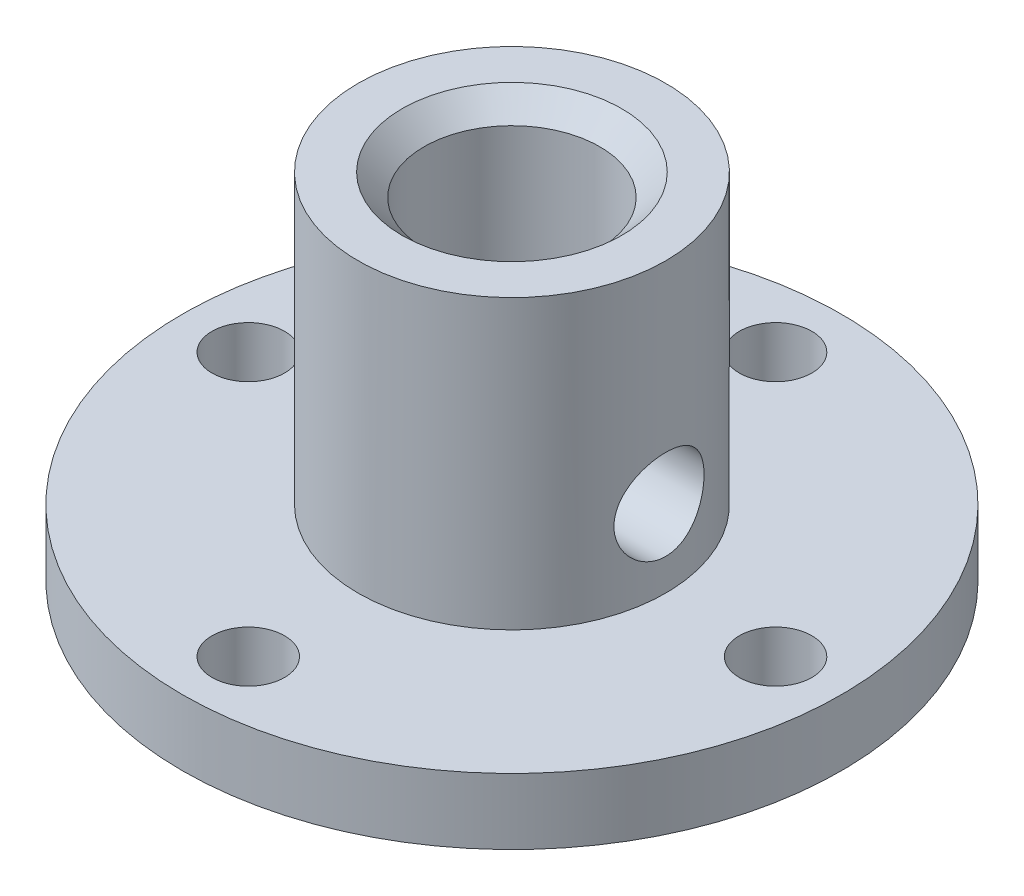
ISO-10303-21;
HEADER;
FILE_DESCRIPTION(('STEP AP214'),'2;1');
FILE_NAME('part.step','',(''),(''),'','','');
FILE_SCHEMA(('AUTOMOTIVE_DESIGN { 1 0 10303 214 1 1 1 1 }'));
ENDSEC;
DATA;
#1=APPLICATION_CONTEXT('core data for automotive mechanical design processes');
#2=APPLICATION_PROTOCOL_DEFINITION('international standard','automotive_design',2000,#1);
#3=PRODUCT_CONTEXT('',#1,'mechanical');
#4=PRODUCT('Part','Part','',(#3));
#5=PRODUCT_RELATED_PRODUCT_CATEGORY('part','',(#4));
#6=PRODUCT_DEFINITION_FORMATION('','',#4);
#7=PRODUCT_DEFINITION_CONTEXT('part definition',#1,'design');
#8=PRODUCT_DEFINITION('design','',#6,#7);
#9=PRODUCT_DEFINITION_SHAPE('','',#8);
#10=(LENGTH_UNIT() NAMED_UNIT(*) SI_UNIT(.MILLI.,.METRE.));
#11=(NAMED_UNIT(*) PLANE_ANGLE_UNIT() SI_UNIT($,.RADIAN.));
#12=(NAMED_UNIT(*) SI_UNIT($,.STERADIAN.) SOLID_ANGLE_UNIT());
#13=UNCERTAINTY_MEASURE_WITH_UNIT(LENGTH_MEASURE(1.E-05),#10,'distance_accuracy_value','');
#14=(GEOMETRIC_REPRESENTATION_CONTEXT(3) GLOBAL_UNCERTAINTY_ASSIGNED_CONTEXT((#13)) GLOBAL_UNIT_ASSIGNED_CONTEXT((#10,
#11,#12)) REPRESENTATION_CONTEXT('',''));
#15=CARTESIAN_POINT('',(0.,0.,0.));
#16=DIRECTION('',(0.,0.,1.));
#17=DIRECTION('',(1.,0.,0.));
#18=AXIS2_PLACEMENT_3D('',#15,#16,#17);
#19=CARTESIAN_POINT('',(0.,3.,0.));
#20=DIRECTION('',(0.,1.,0.));
#21=DIRECTION('',(0.,0.,1.));
#22=AXIS2_PLACEMENT_3D('',#19,#20,#21);
#23=PLANE('',#22);
#24=CARTESIAN_POINT('',(12.,3.,1.25693328198353E-13));
#25=DIRECTION('',(0.,1.,0.));
#26=DIRECTION('',(0.,0.,1.));
#27=AXIS2_PLACEMENT_3D('',#24,#25,#26);
#28=CIRCLE('',#27,1.65);
#29=CARTESIAN_POINT('',(12.,3.,1.65000000000013));
#30=VERTEX_POINT('',#29);
#31=EDGE_CURVE('E87',#30,#30,#28,.T.);
#32=ORIENTED_EDGE('',*,*,#31,.F.);
#33=EDGE_LOOP('',(#32));
#34=FACE_BOUND('',#33,.T.);
#35=CARTESIAN_POINT('',(0.,3.,12.));
#36=DIRECTION('',(0.,1.,0.));
#37=DIRECTION('',(0.,0.,1.));
#38=AXIS2_PLACEMENT_3D('',#35,#36,#37);
#39=CIRCLE('',#38,1.65);
#40=CARTESIAN_POINT('',(0.,3.,13.65));
#41=VERTEX_POINT('',#40);
#42=EDGE_CURVE('E187',#41,#41,#39,.T.);
#43=ORIENTED_EDGE('',*,*,#42,.F.);
#44=EDGE_LOOP('',(#43));
#45=FACE_BOUND('',#44,.T.);
#46=CARTESIAN_POINT('',(-12.,3.,0.));
#47=DIRECTION('',(0.,1.,0.));
#48=DIRECTION('',(0.,0.,1.));
#49=AXIS2_PLACEMENT_3D('',#46,#47,#48);
#50=CIRCLE('',#49,1.65);
#51=CARTESIAN_POINT('',(-12.,3.,1.64999999999996));
#52=VERTEX_POINT('',#51);
#53=EDGE_CURVE('E191',#52,#52,#50,.T.);
#54=ORIENTED_EDGE('',*,*,#53,.F.);
#55=EDGE_LOOP('',(#54));
#56=FACE_BOUND('',#55,.T.);
#57=CARTESIAN_POINT('',(0.,3.,-12.));
#58=DIRECTION('',(0.,1.,0.));
#59=DIRECTION('',(0.,0.,1.));
#60=AXIS2_PLACEMENT_3D('',#57,#58,#59);
#61=CIRCLE('',#60,1.65);
#62=CARTESIAN_POINT('',(0.,3.,-10.35));
#63=VERTEX_POINT('',#62);
#64=EDGE_CURVE('E127',#63,#63,#61,.T.);
#65=ORIENTED_EDGE('',*,*,#64,.F.);
#66=EDGE_LOOP('',(#65));
#67=FACE_BOUND('',#66,.T.);
#68=CARTESIAN_POINT('',(0.,3.,0.));
#69=DIRECTION('',(0.,1.,0.));
#70=DIRECTION('',(0.,0.,1.));
#71=AXIS2_PLACEMENT_3D('',#68,#69,#70);
#72=CIRCLE('',#71,15.);
#73=CARTESIAN_POINT('',(0.,3.,15.));
#74=VERTEX_POINT('',#73);
#75=EDGE_CURVE('E62',#74,#74,#72,.T.);
#76=ORIENTED_EDGE('',*,*,#75,.T.);
#77=EDGE_LOOP('',(#76));
#78=FACE_BOUND('',#77,.T.);
#79=CARTESIAN_POINT('',(0.,3.,0.));
#80=DIRECTION('',(0.,1.,0.));
#81=DIRECTION('',(0.,0.,1.));
#82=AXIS2_PLACEMENT_3D('',#79,#80,#81);
#83=CIRCLE('',#82,7.);
#84=CARTESIAN_POINT('',(0.,3.,7.));
#85=VERTEX_POINT('',#84);
#86=EDGE_CURVE('E162',#85,#85,#83,.T.);
#87=ORIENTED_EDGE('',*,*,#86,.F.);
#88=EDGE_LOOP('',(#87));
#89=FACE_BOUND('',#88,.T.);
#90=ADVANCED_FACE('F49',(#34,#45,#56,#67,#78,#89),#23,.T.);
#91=CARTESIAN_POINT('',(0.,0.,0.));
#92=DIRECTION('',(0.,1.,0.));
#93=DIRECTION('',(0.,0.,1.));
#94=AXIS2_PLACEMENT_3D('',#91,#92,#93);
#95=PLANE('',#94);
#96=CARTESIAN_POINT('',(12.,0.,1.25693328198353E-13));
#97=DIRECTION('',(0.,1.,0.));
#98=DIRECTION('',(0.,0.,1.));
#99=AXIS2_PLACEMENT_3D('',#96,#97,#98);
#100=CIRCLE('',#99,1.65);
#101=CARTESIAN_POINT('',(12.,0.,1.65000000000013));
#102=VERTEX_POINT('',#101);
#103=EDGE_CURVE('E70',#102,#102,#100,.T.);
#104=ORIENTED_EDGE('',*,*,#103,.T.);
#105=EDGE_LOOP('',(#104));
#106=FACE_BOUND('',#105,.T.);
#107=CARTESIAN_POINT('',(0.,0.,12.));
#108=DIRECTION('',(0.,1.,0.));
#109=DIRECTION('',(0.,0.,1.));
#110=AXIS2_PLACEMENT_3D('',#107,#108,#109);
#111=CIRCLE('',#110,1.65);
#112=CARTESIAN_POINT('',(0.,0.,13.65));
#113=VERTEX_POINT('',#112);
#114=EDGE_CURVE('E75',#113,#113,#111,.T.);
#115=ORIENTED_EDGE('',*,*,#114,.T.);
#116=EDGE_LOOP('',(#115));
#117=FACE_BOUND('',#116,.T.);
#118=CARTESIAN_POINT('',(-12.,0.,0.));
#119=DIRECTION('',(0.,1.,0.));
#120=DIRECTION('',(0.,0.,1.));
#121=AXIS2_PLACEMENT_3D('',#118,#119,#120);
#122=CIRCLE('',#121,1.65);
#123=CARTESIAN_POINT('',(-12.,0.,1.64999999999996));
#124=VERTEX_POINT('',#123);
#125=EDGE_CURVE('E79',#124,#124,#122,.T.);
#126=ORIENTED_EDGE('',*,*,#125,.T.);
#127=EDGE_LOOP('',(#126));
#128=FACE_BOUND('',#127,.T.);
#129=CARTESIAN_POINT('',(0.,0.,-12.));
#130=DIRECTION('',(0.,1.,0.));
#131=DIRECTION('',(0.,0.,1.));
#132=AXIS2_PLACEMENT_3D('',#129,#130,#131);
#133=CIRCLE('',#132,1.65);
#134=CARTESIAN_POINT('',(0.,0.,-10.35));
#135=VERTEX_POINT('',#134);
#136=EDGE_CURVE('E83',#135,#135,#133,.T.);
#137=ORIENTED_EDGE('',*,*,#136,.T.);
#138=EDGE_LOOP('',(#137));
#139=FACE_BOUND('',#138,.T.);
#140=CARTESIAN_POINT('',(0.,0.,0.));
#141=DIRECTION('',(0.,1.,0.));
#142=DIRECTION('',(0.,0.,1.));
#143=AXIS2_PLACEMENT_3D('',#140,#141,#142);
#144=CIRCLE('',#143,15.);
#145=CARTESIAN_POINT('',(0.,0.,15.));
#146=VERTEX_POINT('',#145);
#147=EDGE_CURVE('E67',#146,#146,#144,.T.);
#148=ORIENTED_EDGE('',*,*,#147,.F.);
#149=EDGE_LOOP('',(#148));
#150=FACE_BOUND('',#149,.T.);
#151=CARTESIAN_POINT('',(0.,0.,0.));
#152=DIRECTION('',(0.,1.,0.));
#153=DIRECTION('',(0.,0.,1.));
#154=AXIS2_PLACEMENT_3D('',#151,#152,#153);
#155=CIRCLE('',#154,4.);
#156=CARTESIAN_POINT('',(0.,0.,4.));
#157=VERTEX_POINT('',#156);
#158=EDGE_CURVE('E156',#157,#157,#155,.T.);
#159=ORIENTED_EDGE('',*,*,#158,.T.);
#160=EDGE_LOOP('',(#159));
#161=FACE_BOUND('',#160,.T.);
#162=ADVANCED_FACE('F141',(#106,#117,#128,#139,#150,#161),#95,.F.);
#163=CARTESIAN_POINT('',(0.,3.,0.));
#164=DIRECTION('',(0.,-1.,0.));
#165=DIRECTION('',(0.,0.,-1.));
#166=AXIS2_PLACEMENT_3D('',#163,#164,#165);
#167=CYLINDRICAL_SURFACE('',#166,15.);
#168=ORIENTED_EDGE('',*,*,#75,.F.);
#169=EDGE_LOOP('',(#168));
#170=FACE_BOUND('',#169,.T.);
#171=ORIENTED_EDGE('',*,*,#147,.T.);
#172=EDGE_LOOP('',(#171));
#173=FACE_BOUND('',#172,.T.);
#174=ADVANCED_FACE('F137',(#170,#173),#167,.T.);
#175=CARTESIAN_POINT('',(0.,3.,0.));
#176=DIRECTION('',(0.,-1.,0.));
#177=DIRECTION('',(0.,0.,-1.));
#178=AXIS2_PLACEMENT_3D('',#175,#176,#177);
#179=CYLINDRICAL_SURFACE('',#178,4.);
#180=CARTESIAN_POINT('',(0.,15.1000000000002,0.));
#181=DIRECTION('',(0.,1.,0.));
#182=DIRECTION('',(0.,0.,1.));
#183=AXIS2_PLACEMENT_3D('',#180,#181,#182);
#184=CIRCLE('',#183,4.);
#185=CARTESIAN_POINT('',(0.,15.1000000000002,4.));
#186=VERTEX_POINT('',#185);
#187=EDGE_CURVE('E57',#186,#186,#184,.T.);
#188=ORIENTED_EDGE('',*,*,#187,.T.);
#189=EDGE_LOOP('',(#188));
#190=FACE_BOUND('',#189,.T.);
#191=CARTESIAN_POINT('',(3.43474889911912,6.5,2.05));
#192=CARTESIAN_POINT('',(3.43476013460454,6.60639711249915,2.04999099769508));
#193=CARTESIAN_POINT('',(3.43976916731325,6.71292346502074,2.04166020355603));
#194=CARTESIAN_POINT('',(3.45906978256578,6.92267006522949,2.0087744697911));
#195=CARTESIAN_POINT('',(3.47337988610283,7.02588328429963,1.98418715727214));
#196=CARTESIAN_POINT('',(3.50917986343585,7.2255721762216,1.92015139532004));
#197=CARTESIAN_POINT('',(3.53062996278677,7.32208167096073,1.88078512238875));
#198=CARTESIAN_POINT('',(3.57823111890195,7.50710008128519,1.78856006711408));
#199=CARTESIAN_POINT('',(3.60438262844323,7.59560822505235,1.73569998502116));
#200=CARTESIAN_POINT('',(3.66121306315928,7.77059745658523,1.61260552044156));
#201=CARTESIAN_POINT('',(3.69208793471437,7.85623397770229,1.54126047281159));
#202=CARTESIAN_POINT('',(3.75330760428952,8.01498784124639,1.3855270618242));
#203=CARTESIAN_POINT('',(3.78365211882871,8.08809866189189,1.30113194690673));
#204=CARTESIAN_POINT('',(3.84299253593947,8.22486487715659,1.1143049129554));
#205=CARTESIAN_POINT('',(3.87173570781252,8.28746633218173,1.01101358212542));
#206=CARTESIAN_POINT('',(3.92206400565366,8.39401624463961,0.793615485633278));
#207=CARTESIAN_POINT('',(3.94365387156619,8.43797705921357,0.67951594646017));
#208=CARTESIAN_POINT('',(3.97582607146495,8.50260253724661,0.452700875888057));
#209=CARTESIAN_POINT('',(3.98710575481752,8.52475257461731,0.340509760011404));
#210=CARTESIAN_POINT('',(4.00000208593622,8.55003473864598,0.113481846111959));
#211=CARTESIAN_POINT('',(4.00162492402651,8.55317904855925,-0.0013532096558634));
#212=CARTESIAN_POINT('',(3.99534132622229,8.54089857431769,-0.219177580232751));
#213=CARTESIAN_POINT('',(3.98829095062873,8.52714209076627,-0.322291611273034));
#214=CARTESIAN_POINT('',(3.96676595270517,8.48445738258819,-0.524508049687891));
#215=CARTESIAN_POINT('',(3.95229077216325,8.45552801722974,-0.623610154833218));
#216=CARTESIAN_POINT('',(3.91699214020856,8.38317145566431,-0.816663567098655));
#217=CARTESIAN_POINT('',(3.89608719182987,8.33955741781451,-0.910529327027085));
#218=CARTESIAN_POINT('',(3.8497872383769,8.23934893562854,-1.0898279712547));
#219=CARTESIAN_POINT('',(3.82439065747516,8.18274993361848,-1.1752578795057));
#220=CARTESIAN_POINT('',(3.76852818226039,8.0518207533352,-1.34419686269276));
#221=CARTESIAN_POINT('',(3.73780940580388,7.97629662694336,-1.42669759354026));
#222=CARTESIAN_POINT('',(3.6763165211904,7.81283643655143,-1.57842083583647));
#223=CARTESIAN_POINT('',(3.64554238825956,7.72489009176493,-1.64763223578154));
#224=CARTESIAN_POINT('',(3.58508683556871,7.53166375915709,-1.7755276763229));
#225=CARTESIAN_POINT('',(3.55562833707739,7.42560548520832,-1.83315202332217));
#226=CARTESIAN_POINT('',(3.50438982681355,7.20346069421787,-1.92931305416218));
#227=CARTESIAN_POINT('',(3.48260150596414,7.08738519964704,-1.96787041165382));
#228=CARTESIAN_POINT('',(3.45167285173646,6.85826521600331,-2.02159613779181));
#229=CARTESIAN_POINT('',(3.44165729702902,6.74572594062961,-2.03839417316383));
#230=CARTESIAN_POINT('',(3.4329401833739,6.51902032132674,-2.0530492708407));
#231=CARTESIAN_POINT('',(3.43422964338498,6.40485534088499,-2.05092136845613));
#232=CARTESIAN_POINT('',(3.44704643633122,6.19250140442837,-2.02928080760656));
#233=CARTESIAN_POINT('',(3.45735038057704,6.09401417686002,-2.01184470887237));
#234=CARTESIAN_POINT('',(3.48518867929999,5.90157126815566,-1.9632215050227));
#235=CARTESIAN_POINT('',(3.50272553602595,5.80761716784623,-1.932029640798));
#236=CARTESIAN_POINT('',(3.54398596732181,5.62198123084128,-1.85529920190008));
#237=CARTESIAN_POINT('',(3.56795642164126,5.53060129229687,-1.80916818926662));
#238=CARTESIAN_POINT('',(3.6191850503742,5.35634344318387,-1.70437666745408));
#239=CARTESIAN_POINT('',(3.64644491521685,5.27346994490865,-1.64570970400669));
#240=CARTESIAN_POINT('',(3.70556024743405,5.10697348664303,-1.50835203246641));
#241=CARTESIAN_POINT('',(3.73754270221193,5.02473298222051,-1.42803261176893));
#242=CARTESIAN_POINT('',(3.79937740611039,4.87443411147706,-1.25428640146676));
#243=CARTESIAN_POINT('',(3.8292288135691,4.8063813284732,-1.16085447578624));
#244=CARTESIAN_POINT('',(3.88464381358749,4.6845113800162,-0.959564974077706));
#245=CARTESIAN_POINT('',(3.91004178449972,4.63121297031767,-0.851344406017709));
#246=CARTESIAN_POINT('',(3.95240402198471,4.54412311828429,-0.625796760241974));
#247=CARTESIAN_POINT('',(3.96937605229184,4.51031371396611,-0.50847818120992));
#248=CARTESIAN_POINT('',(3.99167712435216,4.46620862712543,-0.280039070644619));
#249=CARTESIAN_POINT('',(3.99795555493602,4.45399142181213,-0.169381817302036));
#250=CARTESIAN_POINT('',(4.00119156419735,4.44767298557688,0.0525683728456607));
#251=CARTESIAN_POINT('',(3.99815275796573,4.45356472837936,0.163861046382002));
#252=CARTESIAN_POINT('',(3.98364611084521,4.48206380190195,0.375531879403652));
#253=CARTESIAN_POINT('',(3.97279568886929,4.50344741731899,0.476121916714076));
#254=CARTESIAN_POINT('',(3.94437437696209,4.56061789690476,0.672101994702144));
#255=CARTESIAN_POINT('',(3.92680256800203,4.59640673076306,0.767491322237517));
#256=CARTESIAN_POINT('',(3.88560694928797,4.6828749680801,0.954795829152983));
#257=CARTESIAN_POINT('',(3.86176373649429,4.73410682233836,1.04640623234806));
#258=CARTESIAN_POINT('',(3.81045726026543,4.8493195986332,1.22009437234666));
#259=CARTESIAN_POINT('',(3.78299235896639,4.91330629562872,1.30216776437378));
#260=CARTESIAN_POINT('',(3.72376714019648,5.05989979749267,1.463448468987));
#261=CARTESIAN_POINT('',(3.69185684741221,5.14374983463882,1.54147441309439));
#262=CARTESIAN_POINT('',(3.62961340005939,5.32367704472788,1.68281984062118));
#263=CARTESIAN_POINT('',(3.59928178706434,5.41976586454226,1.74612515104685));
#264=CARTESIAN_POINT('',(3.54263576749264,5.62652085432675,1.85845823296436));
#265=CARTESIAN_POINT('',(3.51652753235566,5.73761308875499,1.90682276791521));
#266=CARTESIAN_POINT('',(3.48454363329114,5.91028955802274,1.96428815382069));
#267=CARTESIAN_POINT('',(3.4750839946301,5.96879981453381,1.98092157176426));
#268=CARTESIAN_POINT('',(3.4589426547373,6.08741759086197,2.00897497146093));
#269=CARTESIAN_POINT('',(3.45225904753724,6.1475239845367,2.02039853072993));
#270=CARTESIAN_POINT('',(3.44304501092663,6.25634643110406,2.03605144338174));
#271=CARTESIAN_POINT('',(3.43994429952378,6.30487378843443,2.04127510592413));
#272=CARTESIAN_POINT('',(3.43579359538167,6.40225832218478,2.04825156595235));
#273=CARTESIAN_POINT('',(3.43474373694085,6.45111551999388,2.05000413613664));
#274=CARTESIAN_POINT('',(3.43474889911912,6.5,2.05));
#275=B_SPLINE_CURVE_WITH_KNOTS('',3,(#191,#192,#193,#194,#195,#196,#197,#198,#199,#200,#201,
#202,#203,#204,#205,#206,#207,#208,#209,#210,#211,#212,#213,#214,#215,#216,#217,#218,#219,#220,
#221,#222,#223,#224,#225,#226,#227,#228,#229,#230,#231,#232,#233,#234,#235,#236,#237,#238,#239,
#240,#241,#242,#243,#244,#245,#246,#247,#248,#249,#250,#251,#252,#253,#254,#255,#256,#257,#258,
#259,#260,#261,#262,#263,#264,#265,#266,#267,#268,#269,#270,#271,#272,#273,#274),.UNSPECIFIED.,
.T.,.F.,(4,2,2,2,2,2,2,2,2,2,2,2,2,2,2,2,2,2,2,2,2,2,2,2,2,2,2,2,2,2,2,2,2,2,2,2,2,2,2,2,2,4),
(0.,0.318993106571399,0.638623370396568,0.956502079288199,1.27441141842652,1.61994774560716,
1.96566344069096,2.33616921995777,2.70642900031504,3.04924128635574,3.3918337958621,
3.70316374770915,4.01451710940655,4.32999191918197,4.64557762930644,4.9920845431922,
5.33887992946508,5.70966962117727,6.08005639260818,6.4206978273991,6.76106867100023,
7.06136082487838,7.36175695302759,7.67593182810163,7.99026885090682,8.34665089951267,
8.70317293209003,9.07097943408669,9.43844640408396,9.77115764329984,10.1037398067851,
10.412572071749,10.7214465790747,11.043039182816,11.3647777248348,11.7199058506169,
12.075374490222,12.4448933898131,12.6293238388937,12.8136274515198,12.9601802171637,
13.1067425793744),.UNSPECIFIED.);
#276=CARTESIAN_POINT('',(3.43474889911912,6.5,2.05));
#277=VERTEX_POINT('',#276);
#278=EDGE_CURVE('E126',#277,#277,#275,.T.);
#279=ORIENTED_EDGE('',*,*,#278,.F.);
#280=EDGE_LOOP('',(#279));
#281=FACE_BOUND('',#280,.T.);
#282=CARTESIAN_POINT('',(-3.43474889911912,6.5,2.05));
#283=CARTESIAN_POINT('',(-3.43476013460454,6.39360288750085,2.04999099769508));
#284=CARTESIAN_POINT('',(-3.43976916731325,6.28707653497925,2.04166020355603));
#285=CARTESIAN_POINT('',(-3.45906978256578,6.07732993477051,2.0087744697911));
#286=CARTESIAN_POINT('',(-3.47337988610283,5.97411671570037,1.98418715727214));
#287=CARTESIAN_POINT('',(-3.50917986343585,5.77442782377839,1.92015139532004));
#288=CARTESIAN_POINT('',(-3.53062996278677,5.67791832903926,1.88078512238875));
#289=CARTESIAN_POINT('',(-3.57823111890195,5.49289991871481,1.78856006711408));
#290=CARTESIAN_POINT('',(-3.60438262844323,5.40439177494765,1.73569998502116));
#291=CARTESIAN_POINT('',(-3.66121306315928,5.22940254341477,1.61260552044156));
#292=CARTESIAN_POINT('',(-3.69208793471437,5.14376602229771,1.54126047281158));
#293=CARTESIAN_POINT('',(-3.75330760428952,4.98501215875361,1.3855270618242));
#294=CARTESIAN_POINT('',(-3.78365211882871,4.9119013381081,1.30113194690673));
#295=CARTESIAN_POINT('',(-3.84299253593947,4.77513512284341,1.1143049129554));
#296=CARTESIAN_POINT('',(-3.87173570781252,4.71253366781826,1.01101358212542));
#297=CARTESIAN_POINT('',(-3.92206400565366,4.60598375536039,0.793615485633278));
#298=CARTESIAN_POINT('',(-3.94365387156619,4.56202294078643,0.67951594646017));
#299=CARTESIAN_POINT('',(-3.97582607146495,4.49739746275339,0.452700875888057));
#300=CARTESIAN_POINT('',(-3.98710575481752,4.47524742538269,0.340509760011404));
#301=CARTESIAN_POINT('',(-4.00000208593622,4.44996526135401,0.113481846111959));
#302=CARTESIAN_POINT('',(-4.00162492402651,4.44682095144074,-0.00135320965586327));
#303=CARTESIAN_POINT('',(-3.99534132622229,4.45910142568231,-0.21917758023275));
#304=CARTESIAN_POINT('',(-3.98829095062873,4.47285790923373,-0.322291611273034));
#305=CARTESIAN_POINT('',(-3.96676595270517,4.51554261741181,-0.524508049687891));
#306=CARTESIAN_POINT('',(-3.95229077216325,4.54447198277026,-0.623610154833217));
#307=CARTESIAN_POINT('',(-3.91699214020856,4.61682854433569,-0.816663567098654));
#308=CARTESIAN_POINT('',(-3.89608719182987,4.66044258218549,-0.910529327027084));
#309=CARTESIAN_POINT('',(-3.8497872383769,4.76065106437146,-1.0898279712547));
#310=CARTESIAN_POINT('',(-3.82439065747516,4.81725006638152,-1.1752578795057));
#311=CARTESIAN_POINT('',(-3.76852818226039,4.9481792466648,-1.34419686269276));
#312=CARTESIAN_POINT('',(-3.73780940580388,5.02370337305663,-1.42669759354026));
#313=CARTESIAN_POINT('',(-3.6763165211904,5.18716356344857,-1.57842083583647));
#314=CARTESIAN_POINT('',(-3.64554238825956,5.27510990823507,-1.64763223578154));
#315=CARTESIAN_POINT('',(-3.58508683556871,5.46833624084291,-1.7755276763229));
#316=CARTESIAN_POINT('',(-3.55562833707739,5.57439451479168,-1.83315202332217));
#317=CARTESIAN_POINT('',(-3.50438982681355,5.79653930578213,-1.92931305416218));
#318=CARTESIAN_POINT('',(-3.48260150596414,5.91261480035296,-1.96787041165382));
#319=CARTESIAN_POINT('',(-3.45167285173646,6.14173478399669,-2.02159613779181));
#320=CARTESIAN_POINT('',(-3.44165729702902,6.25427405937039,-2.03839417316382));
#321=CARTESIAN_POINT('',(-3.4329401833739,6.48097967867325,-2.0530492708407));
#322=CARTESIAN_POINT('',(-3.43422964338498,6.59514465911501,-2.05092136845613));
#323=CARTESIAN_POINT('',(-3.44704643633122,6.80749859557163,-2.02928080760656));
#324=CARTESIAN_POINT('',(-3.45735038057704,6.90598582313997,-2.01184470887237));
#325=CARTESIAN_POINT('',(-3.48518867929999,7.09842873184434,-1.9632215050227));
#326=CARTESIAN_POINT('',(-3.50272553602594,7.19238283215377,-1.932029640798));
#327=CARTESIAN_POINT('',(-3.54398596732181,7.37801876915872,-1.85529920190008));
#328=CARTESIAN_POINT('',(-3.56795642164126,7.46939870770312,-1.80916818926662));
#329=CARTESIAN_POINT('',(-3.6191850503742,7.64365655681613,-1.70437666745408));
#330=CARTESIAN_POINT('',(-3.64644491521685,7.72653005509134,-1.64570970400669));
#331=CARTESIAN_POINT('',(-3.70556024743405,7.89302651335697,-1.50835203246641));
#332=CARTESIAN_POINT('',(-3.73754270221193,7.97526701777948,-1.42803261176893));
#333=CARTESIAN_POINT('',(-3.79937740611039,8.12556588852293,-1.25428640146676));
#334=CARTESIAN_POINT('',(-3.8292288135691,8.1936186715268,-1.16085447578624));
#335=CARTESIAN_POINT('',(-3.88464381358749,8.3154886199838,-0.959564974077707));
#336=CARTESIAN_POINT('',(-3.91004178449972,8.36878702968233,-0.85134440601771));
#337=CARTESIAN_POINT('',(-3.95240402198471,8.45587688171571,-0.625796760241975));
#338=CARTESIAN_POINT('',(-3.96937605229184,8.48968628603389,-0.50847818120992));
#339=CARTESIAN_POINT('',(-3.99167712435215,8.53379137287457,-0.280039070644621));
#340=CARTESIAN_POINT('',(-3.99795555493602,8.54600857818787,-0.169381817302038));
#341=CARTESIAN_POINT('',(-4.00119156419735,8.55232701442312,0.0525683728456586));
#342=CARTESIAN_POINT('',(-3.99815275796573,8.54643527162064,0.163861046382001));
#343=CARTESIAN_POINT('',(-3.98364611084521,8.51793619809805,0.375531879403651));
#344=CARTESIAN_POINT('',(-3.97279568886929,8.49655258268101,0.476121916714075));
#345=CARTESIAN_POINT('',(-3.94437437696209,8.43938210309523,0.672101994702143));
#346=CARTESIAN_POINT('',(-3.92680256800203,8.40359326923693,0.767491322237516));
#347=CARTESIAN_POINT('',(-3.88560694928797,8.3171250319199,0.954795829152983));
#348=CARTESIAN_POINT('',(-3.86176373649429,8.26589317766164,1.04640623234806));
#349=CARTESIAN_POINT('',(-3.81045726026543,8.1506804013668,1.22009437234666));
#350=CARTESIAN_POINT('',(-3.7829923589664,8.08669370437128,1.30216776437378));
#351=CARTESIAN_POINT('',(-3.72376714019648,7.94010020250733,1.463448468987));
#352=CARTESIAN_POINT('',(-3.69185684741221,7.85625016536118,1.54147441309439));
#353=CARTESIAN_POINT('',(-3.62961340005939,7.67632295527212,1.68281984062118));
#354=CARTESIAN_POINT('',(-3.59928178706434,7.58023413545774,1.74612515104685));
#355=CARTESIAN_POINT('',(-3.54263576749264,7.37347914567325,1.85845823296436));
#356=CARTESIAN_POINT('',(-3.51652753235566,7.26238691124501,1.90682276791521));
#357=CARTESIAN_POINT('',(-3.48454363329114,7.08971044197726,1.96428815382069));
#358=CARTESIAN_POINT('',(-3.4750839946301,7.03120018546618,1.98092157176426));
#359=CARTESIAN_POINT('',(-3.4589426547373,6.91258240913802,2.00897497146093));
#360=CARTESIAN_POINT('',(-3.45225904753724,6.8524760154633,2.02039853072993));
#361=CARTESIAN_POINT('',(-3.44304501092663,6.74365356889594,2.03605144338174));
#362=CARTESIAN_POINT('',(-3.43994429952378,6.69512621156556,2.04127510592413));
#363=CARTESIAN_POINT('',(-3.43579359538167,6.59774167781521,2.04825156595235));
#364=CARTESIAN_POINT('',(-3.43474373694085,6.54888448000612,2.05000413613664));
#365=CARTESIAN_POINT('',(-3.43474889911912,6.5,2.05));
#366=B_SPLINE_CURVE_WITH_KNOTS('',3,(#282,#283,#284,#285,#286,#287,#288,#289,#290,#291,#292,
#293,#294,#295,#296,#297,#298,#299,#300,#301,#302,#303,#304,#305,#306,#307,#308,#309,#310,#311,
#312,#313,#314,#315,#316,#317,#318,#319,#320,#321,#322,#323,#324,#325,#326,#327,#328,#329,#330,
#331,#332,#333,#334,#335,#336,#337,#338,#339,#340,#341,#342,#343,#344,#345,#346,#347,#348,#349,
#350,#351,#352,#353,#354,#355,#356,#357,#358,#359,#360,#361,#362,#363,#364,#365),.UNSPECIFIED.,
.T.,.F.,(4,2,2,2,2,2,2,2,2,2,2,2,2,2,2,2,2,2,2,2,2,2,2,2,2,2,2,2,2,2,2,2,2,2,2,2,2,2,2,2,2,4),
(0.,0.318993106571399,0.638623370396568,0.956502079288199,1.27441141842652,1.61994774560716,
1.96566344069096,2.33616921995777,2.70642900031504,3.04924128635574,3.3918337958621,
3.70316374770915,4.01451710940655,4.32999191918197,4.64557762930644,4.9920845431922,
5.33887992946508,5.70966962117727,6.08005639260818,6.4206978273991,6.76106867100023,
7.06136082487838,7.36175695302759,7.67593182810163,7.99026885090682,8.34665089951267,
8.70317293209003,9.07097943408669,9.43844640408395,9.77115764329983,10.1037398067851,
10.412572071749,10.7214465790747,11.043039182816,11.3647777248348,11.7199058506169,
12.075374490222,12.4448933898131,12.6293238388937,12.8136274515198,12.9601802171636,
13.1067425793744),.UNSPECIFIED.);
#367=CARTESIAN_POINT('',(-3.43474889911912,6.5,2.05));
#368=VERTEX_POINT('',#367);
#369=EDGE_CURVE('E97',#368,#368,#366,.T.);
#370=ORIENTED_EDGE('',*,*,#369,.F.);
#371=EDGE_LOOP('',(#370));
#372=FACE_BOUND('',#371,.T.);
#373=ORIENTED_EDGE('',*,*,#158,.F.);
#374=EDGE_LOOP('',(#373));
#375=FACE_BOUND('',#374,.T.);
#376=ADVANCED_FACE('F133',(#190,#281,#372,#375),#179,.F.);
#377=CARTESIAN_POINT('',(0.,35.8989898732235,0.));
#378=DIRECTION('',(0.,-1.,0.));
#379=DIRECTION('',(0.,0.,-1.));
#380=AXIS2_PLACEMENT_3D('',#377,#378,#379);
#381=CYLINDRICAL_SURFACE('',#380,7.);
#382=CARTESIAN_POINT('',(6.69309345519693,6.5,2.05));
#383=CARTESIAN_POINT('',(6.69309483944126,6.612466900375,2.04999827320297));
#384=CARTESIAN_POINT('',(6.69595921651108,6.72495102238163,2.04071328284842));
#385=CARTESIAN_POINT('',(6.70706409813926,6.94663961785352,2.00390858065056));
#386=CARTESIAN_POINT('',(6.71530659473429,7.05584286040867,1.97638211216836));
#387=CARTESIAN_POINT('',(6.73615587030447,7.26772898524647,1.90410208356032));
#388=CARTESIAN_POINT('',(6.74875564149725,7.37042202592775,1.85937617235207));
#389=CARTESIAN_POINT('',(6.77689043255926,7.56687034312122,1.7540568598823));
#390=CARTESIAN_POINT('',(6.79242584631495,7.66062441771519,1.69346132891123));
#391=CARTESIAN_POINT('',(6.8252068251474,7.83936074132605,1.5561668599668));
#392=CARTESIAN_POINT('',(6.84248750487832,7.92403355024156,1.47907337246136));
#393=CARTESIAN_POINT('',(6.87651127603836,8.07945234998986,1.31181760491498));
#394=CARTESIAN_POINT('',(6.89325430131559,8.15019663253866,1.22165372418862));
#395=CARTESIAN_POINT('',(6.92471358689777,8.27708193735218,1.02862769072689));
#396=CARTESIAN_POINT('',(6.93938363646108,8.33290920793237,0.925551104340486));
#397=CARTESIAN_POINT('',(6.96463721828542,8.42631889384907,0.710970842308477));
#398=CARTESIAN_POINT('',(6.97522158830163,8.46390504987332,0.599468899867296));
#399=CARTESIAN_POINT('',(6.99086282013078,8.51874658697159,0.374438822693844));
#400=CARTESIAN_POINT('',(6.99606290442392,8.5365297608818,0.261049448679591));
#401=CARTESIAN_POINT('',(7.00085322506315,8.5529275544537,0.0327853149521674));
#402=CARTESIAN_POINT('',(7.00044458608044,8.5515460170569,-0.0820891423540254));
#403=CARTESIAN_POINT('',(6.99416557208107,8.53001177651844,-0.306366390062179));
#404=CARTESIAN_POINT('',(6.98846141498169,8.51043031826543,-0.415829410790819));
#405=CARTESIAN_POINT('',(6.97243297785913,8.45398291021688,-0.629841548069563));
#406=CARTESIAN_POINT('',(6.96210841079146,8.41711588654317,-0.734390358876783));
#407=CARTESIAN_POINT('',(6.93776572425408,8.32674589514117,-0.936986490274225));
#408=CARTESIAN_POINT('',(6.92370720342515,8.27305972843847,-1.03494703885868));
#409=CARTESIAN_POINT('',(6.89339316924884,8.15071928075715,-1.22065427763934));
#410=CARTESIAN_POINT('',(6.87713715484778,8.08206158390306,-1.30839862990832));
#411=CARTESIAN_POINT('',(6.8434666814895,7.92874829664306,-1.47459263730577));
#412=CARTESIAN_POINT('',(6.82603160651709,7.84359690540699,-1.55258133812349));
#413=CARTESIAN_POINT('',(6.79249491251666,7.66125130274142,-1.69329842771367));
#414=CARTESIAN_POINT('',(6.77639341345408,7.56405600982895,-1.75602544456128));
#415=CARTESIAN_POINT('',(6.74725168083989,7.35921648194782,-1.86488933742332));
#416=CARTESIAN_POINT('',(6.73423949616148,7.25148818168268,-1.91087608828835));
#417=CARTESIAN_POINT('',(6.71308523101307,7.02934837594316,-1.98392271506866));
#418=CARTESIAN_POINT('',(6.70494164937856,6.91493894245665,-2.01098842545391));
#419=CARTESIAN_POINT('',(6.69477400140158,6.68705492273792,-2.04457820887314));
#420=CARTESIAN_POINT('',(6.692542158909,6.57369236946974,-2.05180007622874));
#421=CARTESIAN_POINT('',(6.69387747182624,6.34737391560914,-2.04744003256902));
#422=CARTESIAN_POINT('',(6.69744386067695,6.23441796324038,-2.03586060719163));
#423=CARTESIAN_POINT('',(6.70977056369052,6.01497893829149,-1.99484680983796));
#424=CARTESIAN_POINT('',(6.71840201031685,5.90840517466871,-1.9658550352883));
#425=CARTESIAN_POINT('',(6.73975445882895,5.70163959690726,-1.8913491937339));
#426=CARTESIAN_POINT('',(6.7524760715344,5.60144873866207,-1.84583265881328));
#427=CARTESIAN_POINT('',(6.78098357958267,5.40743681044429,-1.73822527569995));
#428=CARTESIAN_POINT('',(6.79684004077533,5.31384665403929,-1.67573725335076));
#429=CARTESIAN_POINT('',(6.82967592108244,5.13822531237394,-1.53643689169443));
#430=CARTESIAN_POINT('',(6.84665559558918,5.05619676931832,-1.45962128735743));
#431=CARTESIAN_POINT('',(6.88055882310651,4.9030100289444,-1.29057732939534));
#432=CARTESIAN_POINT('',(6.89745870500806,4.8323448054367,-1.19789642896676));
#433=CARTESIAN_POINT('',(6.9286848338683,4.70756196539247,-1.00159324953194));
#434=CARTESIAN_POINT('',(6.94301121255085,4.65344350181619,-0.897971530958963));
#435=CARTESIAN_POINT('',(6.96738650008499,4.56381086717792,-0.683431756237597));
#436=CARTESIAN_POINT('',(6.97746754535985,4.52815643571647,-0.572576133736129));
#437=CARTESIAN_POINT('',(6.99235827577929,4.47609163680925,-0.346100380952023));
#438=CARTESIAN_POINT('',(6.99716939178528,4.45967604565755,-0.230481552798857));
#439=CARTESIAN_POINT('',(7.00089538691,4.44693686260129,-0.00232766562398188));
#440=CARTESIAN_POINT('',(7.00002057076379,4.44989666563568,0.110164458346313));
#441=CARTESIAN_POINT('',(6.99296418895181,4.47412216593602,0.332980568431777));
#442=CARTESIAN_POINT('',(6.98678290017418,4.49538690806281,0.44330466736579));
#443=CARTESIAN_POINT('',(6.96986420141558,4.55518293643722,0.657605209703259));
#444=CARTESIAN_POINT('',(6.95917208325885,4.5935427861124,0.761633307709326));
#445=CARTESIAN_POINT('',(6.93433949664585,4.68628732304278,0.961832962608175));
#446=CARTESIAN_POINT('',(6.92019847741157,4.74067457010912,1.05800326135855));
#447=CARTESIAN_POINT('',(6.88941672890396,4.8658795320225,1.24298271873));
#448=CARTESIAN_POINT('',(6.87271230244168,4.93715268233663,1.33147293621158));
#449=CARTESIAN_POINT('',(6.83890141540575,5.09327651674203,1.49547758701883));
#450=CARTESIAN_POINT('',(6.82179484262198,5.17813102971524,1.5709883486658));
#451=CARTESIAN_POINT('',(6.7885551864501,5.36186218516073,1.70900807694235));
#452=CARTESIAN_POINT('',(6.77246277330881,5.46106492607572,1.77109378403647));
#453=CARTESIAN_POINT('',(6.74370603371299,5.66895667496229,1.87762939013825));
#454=CARTESIAN_POINT('',(6.73103992209436,5.77764070382459,1.92208847857243));
#455=CARTESIAN_POINT('',(6.71193811008565,5.98792164528234,1.98768914447997));
#456=CARTESIAN_POINT('',(6.70493590145677,6.0887964853609,2.01099357184859));
#457=CARTESIAN_POINT('',(6.69551334504984,6.29310966610908,2.04214841873302));
#458=CARTESIAN_POINT('',(6.69309218190257,6.3965475472682,2.05000158839079));
#459=CARTESIAN_POINT('',(6.69309345519693,6.5,2.05));
#460=B_SPLINE_CURVE_WITH_KNOTS('',3,(#382,#383,#384,#385,#386,#387,#388,#389,#390,#391,#392,
#393,#394,#395,#396,#397,#398,#399,#400,#401,#402,#403,#404,#405,#406,#407,#408,#409,#410,#411,
#412,#413,#414,#415,#416,#417,#418,#419,#420,#421,#422,#423,#424,#425,#426,#427,#428,#429,#430,
#431,#432,#433,#434,#435,#436,#437,#438,#439,#440,#441,#442,#443,#444,#445,#446,#447,#448,#449,
#450,#451,#452,#453,#454,#455,#456,#457,#458,#459),.UNSPECIFIED.,.T.,.F.,(4,2,2,2,2,2,2,2,2,2,2,
2,2,2,2,2,2,2,2,2,2,2,2,2,2,2,2,2,2,2,2,2,2,2,2,2,2,2,4),(0.,0.337019361678633,0.6741636250685,
1.01076816356236,1.34741789769311,1.6932604788276,2.03914544993284,2.39181674591485,
2.74441568934311,3.08737372519966,3.43026299150373,3.76274070497653,4.09523907660368,
4.43149300411513,4.76782373109625,5.11653319115884,5.46527398633269,5.81706939590189,
6.16875627834245,6.50790772722103,6.84701434199819,7.1778459673881,7.50872702167735,
7.84814142303622,8.18763326629225,8.53925223166453,8.89085319441118,9.23974255536415,
9.58853716435036,9.92450628771179,10.2604578814976,10.5931136887241,10.9258226547984,
11.268803762488,11.6118817348934,11.964566066498,12.3170662878078,12.6271280640183,
12.9371346478888),.UNSPECIFIED.);
#461=CARTESIAN_POINT('',(6.69309345519693,6.5,2.05));
#462=VERTEX_POINT('',#461);
#463=EDGE_CURVE('E88',#462,#462,#460,.T.);
#464=ORIENTED_EDGE('',*,*,#463,.T.);
#465=EDGE_LOOP('',(#464));
#466=FACE_BOUND('',#465,.T.);
#467=CARTESIAN_POINT('',(-6.69309345519693,6.5,2.05));
#468=CARTESIAN_POINT('',(-6.69309483944126,6.38753309962499,2.04999827320297));
#469=CARTESIAN_POINT('',(-6.69595921651108,6.27504897761837,2.04071328284842));
#470=CARTESIAN_POINT('',(-6.70706409813926,6.05336038214648,2.00390858065056));
#471=CARTESIAN_POINT('',(-6.71530659473429,5.94415713959133,1.97638211216836));
#472=CARTESIAN_POINT('',(-6.73615587030447,5.73227101475353,1.90410208356032));
#473=CARTESIAN_POINT('',(-6.74875564149725,5.62957797407225,1.85937617235207));
#474=CARTESIAN_POINT('',(-6.77689043255926,5.43312965687878,1.7540568598823));
#475=CARTESIAN_POINT('',(-6.79242584631495,5.33937558228481,1.69346132891123));
#476=CARTESIAN_POINT('',(-6.8252068251474,5.16063925867394,1.5561668599668));
#477=CARTESIAN_POINT('',(-6.84248750487832,5.07596644975844,1.47907337246136));
#478=CARTESIAN_POINT('',(-6.87651127603836,4.92054765001014,1.31181760491498));
#479=CARTESIAN_POINT('',(-6.89325430131559,4.84980336746134,1.22165372418862));
#480=CARTESIAN_POINT('',(-6.92471358689777,4.72291806264782,1.02862769072689));
#481=CARTESIAN_POINT('',(-6.93938363646108,4.66709079206762,0.925551104340485));
#482=CARTESIAN_POINT('',(-6.96463721828542,4.57368110615093,0.710970842308477));
#483=CARTESIAN_POINT('',(-6.97522158830163,4.53609495012668,0.599468899867296));
#484=CARTESIAN_POINT('',(-6.99086282013078,4.4812534130284,0.374438822693844));
#485=CARTESIAN_POINT('',(-6.99606290442392,4.4634702391182,0.261049448679591));
#486=CARTESIAN_POINT('',(-7.00085322506315,4.4470724455463,0.0327853149521675));
#487=CARTESIAN_POINT('',(-7.00044458608044,4.4484539829431,-0.0820891423540254));
#488=CARTESIAN_POINT('',(-6.99416557208107,4.46998822348156,-0.306366390062179));
#489=CARTESIAN_POINT('',(-6.9884614149817,4.48956968173457,-0.415829410790819));
#490=CARTESIAN_POINT('',(-6.97243297785913,4.54601708978311,-0.629841548069563));
#491=CARTESIAN_POINT('',(-6.96210841079146,4.58288411345683,-0.734390358876784));
#492=CARTESIAN_POINT('',(-6.93776572425408,4.67325410485883,-0.936986490274224));
#493=CARTESIAN_POINT('',(-6.92370720342515,4.72694027156153,-1.03494703885868));
#494=CARTESIAN_POINT('',(-6.89339316924884,4.84928071924285,-1.22065427763934));
#495=CARTESIAN_POINT('',(-6.87713715484778,4.91793841609694,-1.30839862990832));
#496=CARTESIAN_POINT('',(-6.8434666814895,5.07125170335694,-1.47459263730578));
#497=CARTESIAN_POINT('',(-6.82603160651709,5.15640309459301,-1.55258133812349));
#498=CARTESIAN_POINT('',(-6.79249491251666,5.33874869725858,-1.69329842771367));
#499=CARTESIAN_POINT('',(-6.77639341345408,5.43594399017105,-1.75602544456128));
#500=CARTESIAN_POINT('',(-6.74725168083989,5.64078351805218,-1.86488933742332));
#501=CARTESIAN_POINT('',(-6.73423949616148,5.74851181831732,-1.91087608828835));
#502=CARTESIAN_POINT('',(-6.71308523101307,5.97065162405684,-1.98392271506866));
#503=CARTESIAN_POINT('',(-6.70494164937856,6.08506105754335,-2.01098842545391));
#504=CARTESIAN_POINT('',(-6.69477400140158,6.31294507726208,-2.04457820887314));
#505=CARTESIAN_POINT('',(-6.692542158909,6.42630763053026,-2.05180007622874));
#506=CARTESIAN_POINT('',(-6.69387747182624,6.65262608439086,-2.04744003256902));
#507=CARTESIAN_POINT('',(-6.69744386067695,6.76558203675962,-2.03586060719163));
#508=CARTESIAN_POINT('',(-6.70977056369052,6.9850210617085,-1.99484680983796));
#509=CARTESIAN_POINT('',(-6.71840201031685,7.09159482533128,-1.9658550352883));
#510=CARTESIAN_POINT('',(-6.73975445882895,7.29836040309274,-1.8913491937339));
#511=CARTESIAN_POINT('',(-6.7524760715344,7.39855126133793,-1.84583265881328));
#512=CARTESIAN_POINT('',(-6.78098357958267,7.59256318955571,-1.73822527569995));
#513=CARTESIAN_POINT('',(-6.79684004077533,7.68615334596071,-1.67573725335076));
#514=CARTESIAN_POINT('',(-6.82967592108244,7.86177468762606,-1.53643689169443));
#515=CARTESIAN_POINT('',(-6.84665559558918,7.94380323068168,-1.45962128735743));
#516=CARTESIAN_POINT('',(-6.88055882310651,8.09698997105559,-1.29057732939534));
#517=CARTESIAN_POINT('',(-6.89745870500806,8.1676551945633,-1.19789642896676));
#518=CARTESIAN_POINT('',(-6.9286848338683,8.29243803460753,-1.00159324953194));
#519=CARTESIAN_POINT('',(-6.94301121255085,8.34655649818381,-0.897971530958963));
#520=CARTESIAN_POINT('',(-6.96738650008499,8.43618913282208,-0.683431756237596));
#521=CARTESIAN_POINT('',(-6.97746754535985,8.47184356428352,-0.572576133736129));
#522=CARTESIAN_POINT('',(-6.99235827577929,8.52390836319075,-0.346100380952022));
#523=CARTESIAN_POINT('',(-6.99716939178528,8.54032395434245,-0.230481552798856));
#524=CARTESIAN_POINT('',(-7.00089538691,8.55306313739871,-0.00232766562398089));
#525=CARTESIAN_POINT('',(-7.00002057076379,8.55010333436432,0.110164458346314));
#526=CARTESIAN_POINT('',(-6.99296418895181,8.52587783406398,0.332980568431778));
#527=CARTESIAN_POINT('',(-6.98678290017418,8.50461309193718,0.443304667365791));
#528=CARTESIAN_POINT('',(-6.96986420141558,8.44481706356278,0.65760520970326));
#529=CARTESIAN_POINT('',(-6.95917208325885,8.4064572138876,0.761633307709327));
#530=CARTESIAN_POINT('',(-6.93433949664585,8.31371267695722,0.961832962608176));
#531=CARTESIAN_POINT('',(-6.92019847741157,8.25932542989088,1.05800326135855));
#532=CARTESIAN_POINT('',(-6.88941672890396,8.13412046797749,1.24298271873));
#533=CARTESIAN_POINT('',(-6.87271230244168,8.06284731766337,1.33147293621158));
#534=CARTESIAN_POINT('',(-6.83890141540575,7.90672348325797,1.49547758701883));
#535=CARTESIAN_POINT('',(-6.82179484262198,7.82186897028476,1.5709883486658));
#536=CARTESIAN_POINT('',(-6.7885551864501,7.63813781483927,1.70900807694235));
#537=CARTESIAN_POINT('',(-6.77246277330881,7.53893507392428,1.77109378403647));
#538=CARTESIAN_POINT('',(-6.74370603371299,7.3310433250377,1.87762939013825));
#539=CARTESIAN_POINT('',(-6.73103992209436,7.2223592961754,1.92208847857243));
#540=CARTESIAN_POINT('',(-6.71193811008565,7.01207835471766,1.98768914447997));
#541=CARTESIAN_POINT('',(-6.70493590145677,6.91120351463909,2.01099357184859));
#542=CARTESIAN_POINT('',(-6.69551334504984,6.70689033389092,2.04214841873302));
#543=CARTESIAN_POINT('',(-6.69309218190257,6.60345245273179,2.05000158839079));
#544=CARTESIAN_POINT('',(-6.69309345519693,6.5,2.05));
#545=B_SPLINE_CURVE_WITH_KNOTS('',3,(#467,#468,#469,#470,#471,#472,#473,#474,#475,#476,#477,
#478,#479,#480,#481,#482,#483,#484,#485,#486,#487,#488,#489,#490,#491,#492,#493,#494,#495,#496,
#497,#498,#499,#500,#501,#502,#503,#504,#505,#506,#507,#508,#509,#510,#511,#512,#513,#514,#515,
#516,#517,#518,#519,#520,#521,#522,#523,#524,#525,#526,#527,#528,#529,#530,#531,#532,#533,#534,
#535,#536,#537,#538,#539,#540,#541,#542,#543,#544),.UNSPECIFIED.,.T.,.F.,(4,2,2,2,2,2,2,2,2,2,2,
2,2,2,2,2,2,2,2,2,2,2,2,2,2,2,2,2,2,2,2,2,2,2,2,2,2,2,4),(0.,0.337019361678633,0.6741636250685,
1.01076816356236,1.34741789769311,1.6932604788276,2.03914544993284,2.39181674591485,
2.74441568934311,3.08737372519966,3.43026299150373,3.76274070497653,4.09523907660368,
4.43149300411513,4.76782373109625,5.11653319115884,5.46527398633269,5.81706939590189,
6.16875627834245,6.50790772722103,6.84701434199819,7.1778459673881,7.50872702167735,
7.84814142303622,8.18763326629225,8.53925223166453,8.89085319441118,9.23974255536415,
9.58853716435036,9.92450628771179,10.2604578814976,10.5931136887241,10.9258226547984,
11.268803762488,11.6118817348934,11.964566066498,12.3170662878078,12.6271280640183,
12.9371346478888),.UNSPECIFIED.);
#546=CARTESIAN_POINT('',(-6.69309345519693,6.5,2.05));
#547=VERTEX_POINT('',#546);
#548=EDGE_CURVE('E74',#547,#547,#545,.T.);
#549=ORIENTED_EDGE('',*,*,#548,.T.);
#550=EDGE_LOOP('',(#549));
#551=FACE_BOUND('',#550,.T.);
#552=ORIENTED_EDGE('',*,*,#86,.T.);
#553=EDGE_LOOP('',(#552));
#554=FACE_BOUND('',#553,.T.);
#555=CARTESIAN_POINT('',(0.,16.1000000000002,0.));
#556=DIRECTION('',(0.,1.,0.));
#557=DIRECTION('',(-1.,0.,0.));
#558=AXIS2_PLACEMENT_3D('',#555,#556,#557);
#559=CIRCLE('',#558,7.);
#560=CARTESIAN_POINT('',(-7.,16.1000000000002,0.));
#561=VERTEX_POINT('',#560);
#562=EDGE_CURVE('E159',#561,#561,#559,.T.);
#563=ORIENTED_EDGE('',*,*,#562,.F.);
#564=EDGE_LOOP('',(#563));
#565=FACE_BOUND('',#564,.T.);
#566=ADVANCED_FACE('F102',(#466,#551,#554,#565),#381,.T.);
#567=CARTESIAN_POINT('',(19.708780243112,16.1000000000002,47.1228604960344));
#568=DIRECTION('',(0.,1.,0.));
#569=DIRECTION('',(0.999980854034441,0.,0.00618801782078447));
#570=AXIS2_PLACEMENT_3D('',#567,#568,#569);
#571=PLANE('',#570);
#572=CARTESIAN_POINT('',(0.,16.1000000000002,0.));
#573=DIRECTION('',(0.,1.,0.));
#574=DIRECTION('',(-1.,0.,0.));
#575=AXIS2_PLACEMENT_3D('',#572,#573,#574);
#576=CIRCLE('',#575,5.);
#577=CARTESIAN_POINT('',(-5.,16.1000000000002,0.));
#578=VERTEX_POINT('',#577);
#579=EDGE_CURVE('E11',#578,#578,#576,.F.);
#580=ORIENTED_EDGE('',*,*,#579,.T.);
#581=EDGE_LOOP('',(#580));
#582=FACE_BOUND('',#581,.T.);
#583=ORIENTED_EDGE('',*,*,#562,.T.);
#584=EDGE_LOOP('',(#583));
#585=FACE_BOUND('',#584,.T.);
#586=ADVANCED_FACE('F114',(#582,#585),#571,.T.);
#587=CARTESIAN_POINT('',(10.,6.5,0.));
#588=DIRECTION('',(-1.,0.,0.));
#589=DIRECTION('',(0.,0.,1.));
#590=AXIS2_PLACEMENT_3D('',#587,#588,#589);
#591=CYLINDRICAL_SURFACE('',#590,2.05);
#592=ORIENTED_EDGE('',*,*,#369,.T.);
#593=EDGE_LOOP('',(#592));
#594=FACE_BOUND('',#593,.T.);
#595=ORIENTED_EDGE('',*,*,#548,.F.);
#596=EDGE_LOOP('',(#595));
#597=FACE_BOUND('',#596,.T.);
#598=ADVANCED_FACE('F111',(#594,#597),#591,.F.);
#599=ORIENTED_EDGE('',*,*,#278,.T.);
#600=EDGE_LOOP('',(#599));
#601=FACE_BOUND('',#600,.T.);
#602=ORIENTED_EDGE('',*,*,#463,.F.);
#603=EDGE_LOOP('',(#602));
#604=FACE_BOUND('',#603,.T.);
#605=ADVANCED_FACE('F106',(#601,#604),#591,.F.);
#606=CARTESIAN_POINT('',(0.,-1.,-12.));
#607=DIRECTION('',(0.,1.,0.));
#608=DIRECTION('',(0.,0.,1.));
#609=AXIS2_PLACEMENT_3D('',#606,#607,#608);
#610=CYLINDRICAL_SURFACE('',#609,1.65);
#611=ORIENTED_EDGE('',*,*,#64,.T.);
#612=EDGE_LOOP('',(#611));
#613=FACE_BOUND('',#612,.T.);
#614=ORIENTED_EDGE('',*,*,#136,.F.);
#615=EDGE_LOOP('',(#614));
#616=FACE_BOUND('',#615,.T.);
#617=ADVANCED_FACE('F110',(#613,#616),#610,.F.);
#618=CARTESIAN_POINT('',(-12.,-1.,0.));
#619=DIRECTION('',(0.,1.,0.));
#620=DIRECTION('',(0.,0.,1.));
#621=AXIS2_PLACEMENT_3D('',#618,#619,#620);
#622=CYLINDRICAL_SURFACE('',#621,1.65);
#623=ORIENTED_EDGE('',*,*,#53,.T.);
#624=EDGE_LOOP('',(#623));
#625=FACE_BOUND('',#624,.T.);
#626=ORIENTED_EDGE('',*,*,#125,.F.);
#627=EDGE_LOOP('',(#626));
#628=FACE_BOUND('',#627,.T.);
#629=ADVANCED_FACE('F202',(#625,#628),#622,.F.);
#630=CARTESIAN_POINT('',(0.,-1.,12.));
#631=DIRECTION('',(0.,1.,0.));
#632=DIRECTION('',(0.,0.,1.));
#633=AXIS2_PLACEMENT_3D('',#630,#631,#632);
#634=CYLINDRICAL_SURFACE('',#633,1.65);
#635=ORIENTED_EDGE('',*,*,#42,.T.);
#636=EDGE_LOOP('',(#635));
#637=FACE_BOUND('',#636,.T.);
#638=ORIENTED_EDGE('',*,*,#114,.F.);
#639=EDGE_LOOP('',(#638));
#640=FACE_BOUND('',#639,.T.);
#641=ADVANCED_FACE('F211',(#637,#640),#634,.F.);
#642=CARTESIAN_POINT('',(12.,-1.,1.25693328198353E-13));
#643=DIRECTION('',(0.,1.,0.));
#644=DIRECTION('',(0.,0.,1.));
#645=AXIS2_PLACEMENT_3D('',#642,#643,#644);
#646=CYLINDRICAL_SURFACE('',#645,1.65);
#647=ORIENTED_EDGE('',*,*,#31,.T.);
#648=EDGE_LOOP('',(#647));
#649=FACE_BOUND('',#648,.T.);
#650=ORIENTED_EDGE('',*,*,#103,.F.);
#651=EDGE_LOOP('',(#650));
#652=FACE_BOUND('',#651,.T.);
#653=ADVANCED_FACE('F216',(#649,#652),#646,.F.);
#654=CARTESIAN_POINT('',(0.,15.1000000000002,0.));
#655=DIRECTION('',(0.,1.,0.));
#656=DIRECTION('',(0.,0.,1.));
#657=AXIS2_PLACEMENT_3D('',#654,#655,#656);
#658=CONICAL_SURFACE('',#657,4.,0.785398163397448);
#659=ORIENTED_EDGE('',*,*,#579,.F.);
#660=EDGE_LOOP('',(#659));
#661=FACE_BOUND('',#660,.T.);
#662=ORIENTED_EDGE('',*,*,#187,.F.);
#663=EDGE_LOOP('',(#662));
#664=FACE_BOUND('',#663,.T.);
#665=ADVANCED_FACE('F51',(#661,#664),#658,.F.);
#666=CLOSED_SHELL('',(#90,#162,#174,#376,#566,#586,#598,#605,#617,#629,#641,#653,#665));
#667=MANIFOLD_SOLID_BREP('B2',#666);
#668=ADVANCED_BREP_SHAPE_REPRESENTATION('',(#18,#667),#14);
#669=SHAPE_DEFINITION_REPRESENTATION(#9,#668);
ENDSEC;
END-ISO-10303-21;
